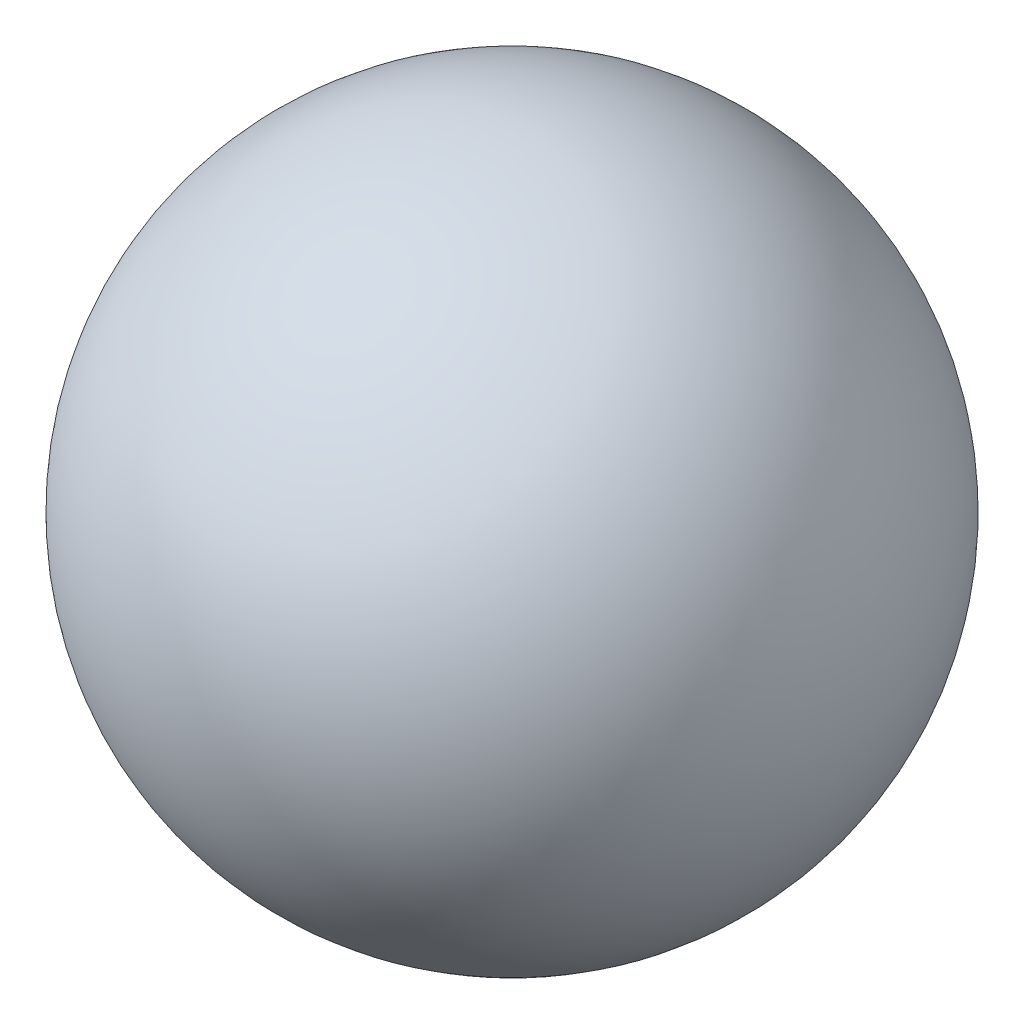
ISO-10303-21;
HEADER;
FILE_DESCRIPTION(('STEP AP214'),'2;1');
FILE_NAME('part.step','',(''),(''),'','','');
FILE_SCHEMA(('AUTOMOTIVE_DESIGN { 1 0 10303 214 1 1 1 1 }'));
ENDSEC;
DATA;
#1=APPLICATION_CONTEXT('core data for automotive mechanical design processes');
#2=APPLICATION_PROTOCOL_DEFINITION('international standard','automotive_design',2000,#1);
#3=PRODUCT_CONTEXT('',#1,'mechanical');
#4=PRODUCT('Part','Part','',(#3));
#5=PRODUCT_RELATED_PRODUCT_CATEGORY('part','',(#4));
#6=PRODUCT_DEFINITION_FORMATION('','',#4);
#7=PRODUCT_DEFINITION_CONTEXT('part definition',#1,'design');
#8=PRODUCT_DEFINITION('design','',#6,#7);
#9=PRODUCT_DEFINITION_SHAPE('','',#8);
#10=(LENGTH_UNIT() NAMED_UNIT(*) SI_UNIT(.MILLI.,.METRE.));
#11=(NAMED_UNIT(*) PLANE_ANGLE_UNIT() SI_UNIT($,.RADIAN.));
#12=(NAMED_UNIT(*) SI_UNIT($,.STERADIAN.) SOLID_ANGLE_UNIT());
#13=UNCERTAINTY_MEASURE_WITH_UNIT(LENGTH_MEASURE(1.E-05),#10,'distance_accuracy_value','');
#14=(GEOMETRIC_REPRESENTATION_CONTEXT(3) GLOBAL_UNCERTAINTY_ASSIGNED_CONTEXT((#13)) GLOBAL_UNIT_ASSIGNED_CONTEXT((#10,
#11,#12)) REPRESENTATION_CONTEXT('',''));
#15=CARTESIAN_POINT('',(0.,0.,0.));
#16=DIRECTION('',(0.,0.,1.));
#17=DIRECTION('',(1.,0.,0.));
#18=AXIS2_PLACEMENT_3D('',#15,#16,#17);
#19=CARTESIAN_POINT('',(0.,0.,0.));
#20=DIRECTION('',(0.,1.,0.));
#21=DIRECTION('',(1.,0.,0.));
#22=AXIS2_PLACEMENT_3D('',#19,#20,#21);
#23=SPHERICAL_SURFACE('',#22,5.);
#24=CARTESIAN_POINT('',(0.,-4.76969600708473,0.));
#25=DIRECTION('',(0.,1.,0.));
#26=DIRECTION('',(-1.,0.,0.));
#27=AXIS2_PLACEMENT_3D('',#24,#25,#26);
#28=CIRCLE('',#27,1.5);
#29=CARTESIAN_POINT('',(-1.5,-4.76969600708473,0.));
#30=VERTEX_POINT('',#29);
#31=EDGE_CURVE('E38',#30,#30,#28,.T.);
#32=ORIENTED_EDGE('',*,*,#31,.T.);
#33=EDGE_LOOP('',(#32));
#34=FACE_BOUND('',#33,.T.);
#35=ADVANCED_FACE('F32',(#34),#23,.T.);
#36=CARTESIAN_POINT('',(0.,0.,0.));
#37=DIRECTION('',(0.,1.,0.));
#38=DIRECTION('',(-1.,0.,0.));
#39=AXIS2_PLACEMENT_3D('',#36,#37,#38);
#40=SPHERICAL_SURFACE('',#39,4.);
#41=CARTESIAN_POINT('',(0.,-3.70809924354783,0.));
#42=DIRECTION('',(0.,1.,0.));
#43=DIRECTION('',(-1.,0.,0.));
#44=AXIS2_PLACEMENT_3D('',#41,#42,#43);
#45=CIRCLE('',#44,1.5);
#46=CARTESIAN_POINT('',(-1.5,-3.70809924354783,0.));
#47=VERTEX_POINT('',#46);
#48=EDGE_CURVE('E10',#47,#47,#45,.T.);
#49=ORIENTED_EDGE('',*,*,#48,.F.);
#50=EDGE_LOOP('',(#49));
#51=FACE_BOUND('',#50,.T.);
#52=ADVANCED_FACE('F47',(#51),#40,.F.);
#53=CARTESIAN_POINT('',(0.,5.,0.));
#54=DIRECTION('',(0.,1.,0.));
#55=DIRECTION('',(-1.,0.,0.));
#56=AXIS2_PLACEMENT_3D('',#53,#54,#55);
#57=CYLINDRICAL_SURFACE('',#56,1.5);
#58=ORIENTED_EDGE('',*,*,#48,.T.);
#59=EDGE_LOOP('',(#58));
#60=FACE_BOUND('',#59,.T.);
#61=ORIENTED_EDGE('',*,*,#31,.F.);
#62=EDGE_LOOP('',(#61));
#63=FACE_BOUND('',#62,.T.);
#64=ADVANCED_FACE('F45',(#60,#63),#57,.F.);
#65=CLOSED_SHELL('',(#35,#52,#64));
#66=MANIFOLD_SOLID_BREP('B2',#65);
#67=ADVANCED_BREP_SHAPE_REPRESENTATION('',(#18,#66),#14);
#68=SHAPE_DEFINITION_REPRESENTATION(#9,#67);
ENDSEC;
END-ISO-10303-21;
